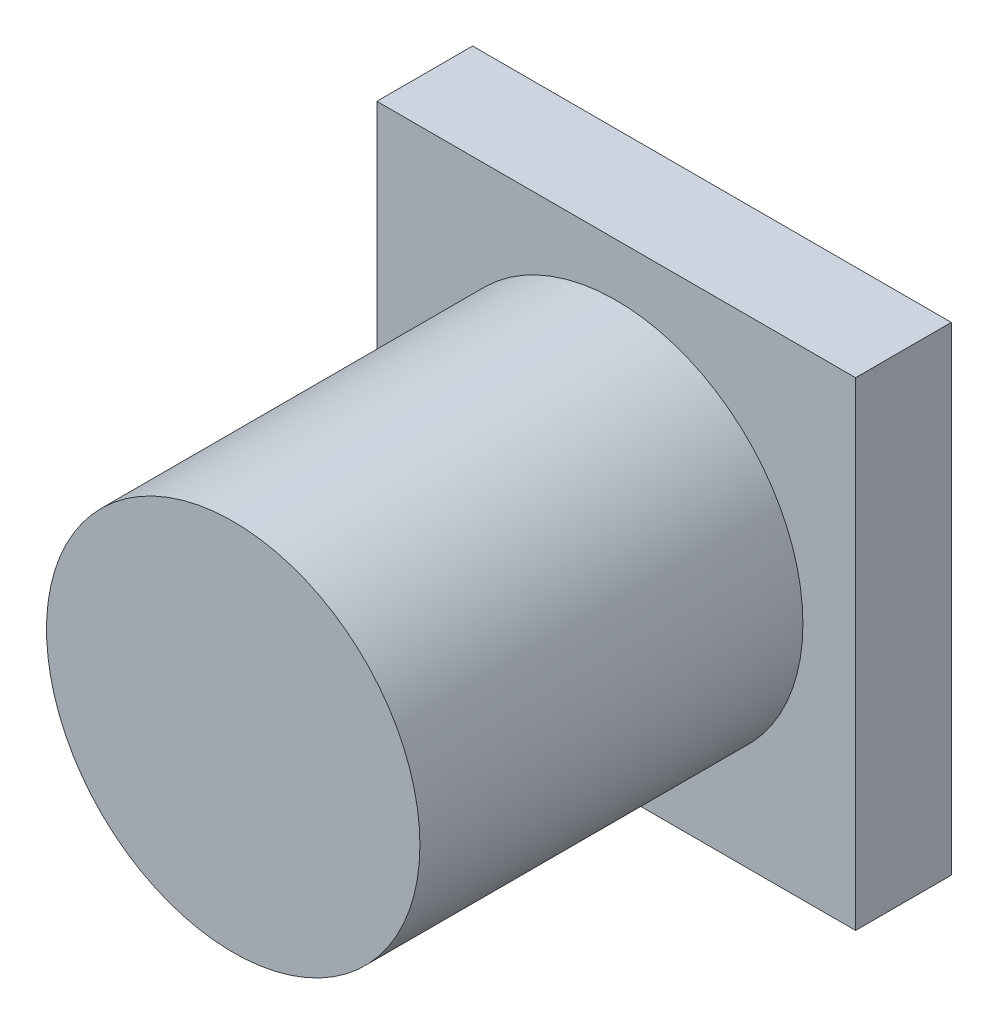
ISO-10303-21;
HEADER;
FILE_DESCRIPTION(('STEP AP214'),'2;1');
FILE_NAME('part.step','',(''),(''),'','','');
FILE_SCHEMA(('AUTOMOTIVE_DESIGN { 1 0 10303 214 1 1 1 1 }'));
ENDSEC;
DATA;
#1=APPLICATION_CONTEXT('core data for automotive mechanical design processes');
#2=APPLICATION_PROTOCOL_DEFINITION('international standard','automotive_design',2000,#1);
#3=PRODUCT_CONTEXT('',#1,'mechanical');
#4=PRODUCT('Part','Part','',(#3));
#5=PRODUCT_RELATED_PRODUCT_CATEGORY('part','',(#4));
#6=PRODUCT_DEFINITION_FORMATION('','',#4);
#7=PRODUCT_DEFINITION_CONTEXT('part definition',#1,'design');
#8=PRODUCT_DEFINITION('design','',#6,#7);
#9=PRODUCT_DEFINITION_SHAPE('','',#8);
#10=(LENGTH_UNIT() NAMED_UNIT(*) SI_UNIT(.MILLI.,.METRE.));
#11=(NAMED_UNIT(*) PLANE_ANGLE_UNIT() SI_UNIT($,.RADIAN.));
#12=(NAMED_UNIT(*) SI_UNIT($,.STERADIAN.) SOLID_ANGLE_UNIT());
#13=UNCERTAINTY_MEASURE_WITH_UNIT(LENGTH_MEASURE(1.E-05),#10,'distance_accuracy_value','');
#14=(GEOMETRIC_REPRESENTATION_CONTEXT(3) GLOBAL_UNCERTAINTY_ASSIGNED_CONTEXT((#13)) GLOBAL_UNIT_ASSIGNED_CONTEXT((#10,
#11,#12)) REPRESENTATION_CONTEXT('',''));
#15=CARTESIAN_POINT('',(0.,0.,0.));
#16=DIRECTION('',(0.,0.,1.));
#17=DIRECTION('',(1.,0.,0.));
#18=AXIS2_PLACEMENT_3D('',#15,#16,#17);
#19=CARTESIAN_POINT('',(5.,5.,2.));
#20=DIRECTION('',(-1.,0.,0.));
#21=DIRECTION('',(0.,-1.,0.));
#22=AXIS2_PLACEMENT_3D('',#19,#20,#21);
#23=PLANE('',#22);
#24=DIRECTION('',(0.,1.,0.));
#25=VECTOR('',#24,1.);
#26=CARTESIAN_POINT('',(5.,5.,0.));
#27=LINE('',#26,#25);
#28=CARTESIAN_POINT('',(5.,-5.,0.));
#29=VERTEX_POINT('',#28);
#30=CARTESIAN_POINT('',(5.,5.,0.));
#31=VERTEX_POINT('',#30);
#32=EDGE_CURVE('E110',#29,#31,#27,.T.);
#33=ORIENTED_EDGE('',*,*,#32,.T.);
#34=DIRECTION('',(0.,0.,-1.));
#35=VECTOR('',#34,1.);
#36=CARTESIAN_POINT('',(5.,5.,2.));
#37=LINE('',#36,#35);
#38=CARTESIAN_POINT('',(5.,5.,2.));
#39=VERTEX_POINT('',#38);
#40=EDGE_CURVE('E42',#39,#31,#37,.T.);
#41=ORIENTED_EDGE('',*,*,#40,.F.);
#42=DIRECTION('',(0.,1.,0.));
#43=VECTOR('',#42,1.);
#44=CARTESIAN_POINT('',(5.,5.,2.));
#45=LINE('',#44,#43);
#46=CARTESIAN_POINT('',(5.,-5.,2.));
#47=VERTEX_POINT('',#46);
#48=EDGE_CURVE('E93',#47,#39,#45,.T.);
#49=ORIENTED_EDGE('',*,*,#48,.F.);
#50=DIRECTION('',(0.,0.,-1.));
#51=VECTOR('',#50,1.);
#52=CARTESIAN_POINT('',(5.,-5.,2.));
#53=LINE('',#52,#51);
#54=EDGE_CURVE('E106',#47,#29,#53,.T.);
#55=ORIENTED_EDGE('',*,*,#54,.T.);
#56=EDGE_LOOP('',(#33,#41,#49,#55));
#57=FACE_BOUND('',#56,.T.);
#58=ADVANCED_FACE('F39',(#57),#23,.F.);
#59=CARTESIAN_POINT('',(-5.,5.,2.));
#60=DIRECTION('',(0.,-1.,0.));
#61=DIRECTION('',(0.,0.,-1.));
#62=AXIS2_PLACEMENT_3D('',#59,#60,#61);
#63=PLANE('',#62);
#64=DIRECTION('',(-1.,0.,0.));
#65=VECTOR('',#64,1.);
#66=CARTESIAN_POINT('',(-5.,5.,0.));
#67=LINE('',#66,#65);
#68=CARTESIAN_POINT('',(-5.,5.,0.));
#69=VERTEX_POINT('',#68);
#70=EDGE_CURVE('E99',#31,#69,#67,.T.);
#71=ORIENTED_EDGE('',*,*,#70,.T.);
#72=DIRECTION('',(0.,0.,-1.));
#73=VECTOR('',#72,1.);
#74=CARTESIAN_POINT('',(-5.,5.,2.));
#75=LINE('',#74,#73);
#76=CARTESIAN_POINT('',(-5.,5.,2.));
#77=VERTEX_POINT('',#76);
#78=EDGE_CURVE('E97',#77,#69,#75,.T.);
#79=ORIENTED_EDGE('',*,*,#78,.F.);
#80=DIRECTION('',(-1.,0.,0.));
#81=VECTOR('',#80,1.);
#82=CARTESIAN_POINT('',(-5.,5.,2.));
#83=LINE('',#82,#81);
#84=EDGE_CURVE('E88',#39,#77,#83,.T.);
#85=ORIENTED_EDGE('',*,*,#84,.F.);
#86=ORIENTED_EDGE('',*,*,#40,.T.);
#87=EDGE_LOOP('',(#71,#79,#85,#86));
#88=FACE_BOUND('',#87,.T.);
#89=ADVANCED_FACE('F98',(#88),#63,.F.);
#90=CARTESIAN_POINT('',(-5.,5.,2.));
#91=DIRECTION('',(1.,0.,0.));
#92=DIRECTION('',(0.,1.,0.));
#93=AXIS2_PLACEMENT_3D('',#90,#91,#92);
#94=PLANE('',#93);
#95=DIRECTION('',(0.,-1.,0.));
#96=VECTOR('',#95,1.);
#97=CARTESIAN_POINT('',(-5.,5.,0.));
#98=LINE('',#97,#96);
#99=CARTESIAN_POINT('',(-5.,-5.,0.));
#100=VERTEX_POINT('',#99);
#101=EDGE_CURVE('E74',#69,#100,#98,.T.);
#102=ORIENTED_EDGE('',*,*,#101,.T.);
#103=DIRECTION('',(0.,0.,-1.));
#104=VECTOR('',#103,1.);
#105=CARTESIAN_POINT('',(-5.,-5.,2.));
#106=LINE('',#105,#104);
#107=CARTESIAN_POINT('',(-5.,-5.,2.));
#108=VERTEX_POINT('',#107);
#109=EDGE_CURVE('E101',#108,#100,#106,.T.);
#110=ORIENTED_EDGE('',*,*,#109,.F.);
#111=DIRECTION('',(0.,-1.,0.));
#112=VECTOR('',#111,1.);
#113=CARTESIAN_POINT('',(-5.,5.,2.));
#114=LINE('',#113,#112);
#115=EDGE_CURVE('E91',#77,#108,#114,.T.);
#116=ORIENTED_EDGE('',*,*,#115,.F.);
#117=ORIENTED_EDGE('',*,*,#78,.T.);
#118=EDGE_LOOP('',(#102,#110,#116,#117));
#119=FACE_BOUND('',#118,.T.);
#120=ADVANCED_FACE('F102',(#119),#94,.F.);
#121=CARTESIAN_POINT('',(-5.,-5.,2.));
#122=DIRECTION('',(0.,1.,0.));
#123=DIRECTION('',(0.,0.,1.));
#124=AXIS2_PLACEMENT_3D('',#121,#122,#123);
#125=PLANE('',#124);
#126=DIRECTION('',(1.,0.,0.));
#127=VECTOR('',#126,1.);
#128=CARTESIAN_POINT('',(-5.,-5.,0.));
#129=LINE('',#128,#127);
#130=EDGE_CURVE('E80',#100,#29,#129,.T.);
#131=ORIENTED_EDGE('',*,*,#130,.T.);
#132=ORIENTED_EDGE('',*,*,#54,.F.);
#133=DIRECTION('',(1.,0.,0.));
#134=VECTOR('',#133,1.);
#135=CARTESIAN_POINT('',(-5.,-5.,2.));
#136=LINE('',#135,#134);
#137=EDGE_CURVE('E57',#108,#47,#136,.T.);
#138=ORIENTED_EDGE('',*,*,#137,.F.);
#139=ORIENTED_EDGE('',*,*,#109,.T.);
#140=EDGE_LOOP('',(#131,#132,#138,#139));
#141=FACE_BOUND('',#140,.T.);
#142=ADVANCED_FACE('F124',(#141),#125,.F.);
#143=CARTESIAN_POINT('',(0.,0.,2.));
#144=DIRECTION('',(0.,0.,1.));
#145=DIRECTION('',(1.,0.,0.));
#146=AXIS2_PLACEMENT_3D('',#143,#144,#145);
#147=PLANE('',#146);
#148=CARTESIAN_POINT('',(0.,0.,2.));
#149=DIRECTION('',(0.,0.,1.));
#150=DIRECTION('',(1.,0.,0.));
#151=AXIS2_PLACEMENT_3D('',#148,#149,#150);
#152=CIRCLE('',#151,3.9);
#153=CARTESIAN_POINT('',(3.9,0.,2.));
#154=VERTEX_POINT('',#153);
#155=EDGE_CURVE('E11',#154,#154,#152,.T.);
#156=ORIENTED_EDGE('',*,*,#155,.F.);
#157=EDGE_LOOP('',(#156));
#158=FACE_BOUND('',#157,.T.);
#159=ORIENTED_EDGE('',*,*,#48,.T.);
#160=ORIENTED_EDGE('',*,*,#84,.T.);
#161=ORIENTED_EDGE('',*,*,#115,.T.);
#162=ORIENTED_EDGE('',*,*,#137,.T.);
#163=EDGE_LOOP('',(#159,#160,#161,#162));
#164=FACE_BOUND('',#163,.T.);
#165=ADVANCED_FACE('F89',(#158,#164),#147,.T.);
#166=CARTESIAN_POINT('',(0.,0.,0.));
#167=DIRECTION('',(0.,0.,1.));
#168=DIRECTION('',(1.,0.,0.));
#169=AXIS2_PLACEMENT_3D('',#166,#167,#168);
#170=PLANE('',#169);
#171=ORIENTED_EDGE('',*,*,#32,.F.);
#172=ORIENTED_EDGE('',*,*,#130,.F.);
#173=ORIENTED_EDGE('',*,*,#101,.F.);
#174=ORIENTED_EDGE('',*,*,#70,.F.);
#175=EDGE_LOOP('',(#171,#172,#173,#174));
#176=FACE_BOUND('',#175,.T.);
#177=ADVANCED_FACE('F127',(#176),#170,.F.);
#178=CARTESIAN_POINT('',(0.,0.,10.));
#179=DIRECTION('',(0.,0.,-1.));
#180=DIRECTION('',(-1.,0.,0.));
#181=AXIS2_PLACEMENT_3D('',#178,#179,#180);
#182=CYLINDRICAL_SURFACE('',#181,3.9);
#183=CARTESIAN_POINT('',(0.,0.,10.));
#184=DIRECTION('',(0.,0.,1.));
#185=DIRECTION('',(1.,0.,0.));
#186=AXIS2_PLACEMENT_3D('',#183,#184,#185);
#187=CIRCLE('',#186,3.9);
#188=CARTESIAN_POINT('',(3.9,0.,10.));
#189=VERTEX_POINT('',#188);
#190=EDGE_CURVE('E114',#189,#189,#187,.T.);
#191=ORIENTED_EDGE('',*,*,#190,.F.);
#192=EDGE_LOOP('',(#191));
#193=FACE_BOUND('',#192,.T.);
#194=ORIENTED_EDGE('',*,*,#155,.T.);
#195=EDGE_LOOP('',(#194));
#196=FACE_BOUND('',#195,.T.);
#197=ADVANCED_FACE('F137',(#193,#196),#182,.T.);
#198=CARTESIAN_POINT('',(0.,0.,10.));
#199=DIRECTION('',(0.,0.,1.));
#200=DIRECTION('',(1.,0.,0.));
#201=AXIS2_PLACEMENT_3D('',#198,#199,#200);
#202=PLANE('',#201);
#203=ORIENTED_EDGE('',*,*,#190,.T.);
#204=EDGE_LOOP('',(#203));
#205=FACE_BOUND('',#204,.T.);
#206=ADVANCED_FACE('F135',(#205),#202,.T.);
#207=CLOSED_SHELL('',(#58,#89,#120,#142,#165,#177,#197,#206));
#208=MANIFOLD_SOLID_BREP('B2',#207);
#209=ADVANCED_BREP_SHAPE_REPRESENTATION('',(#18,#208),#14);
#210=SHAPE_DEFINITION_REPRESENTATION(#9,#209);
ENDSEC;
END-ISO-10303-21;
